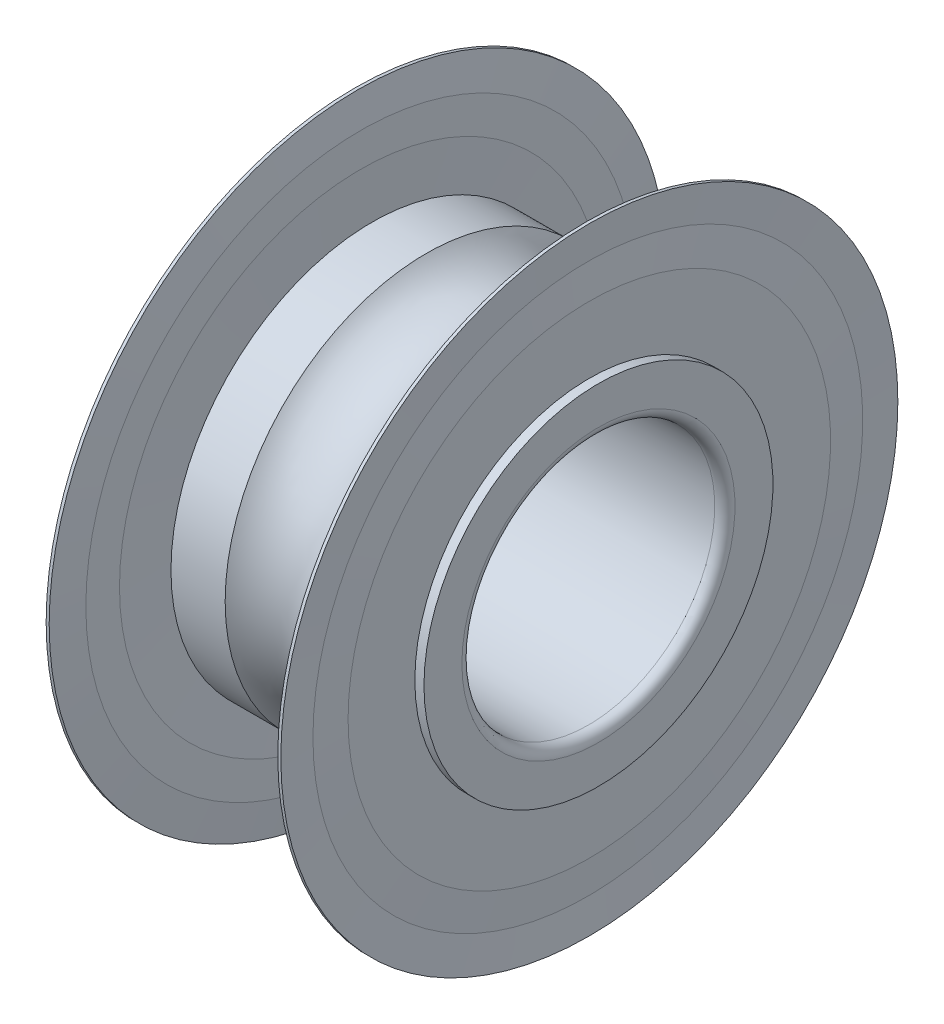
ISO-10303-21;
HEADER;
FILE_DESCRIPTION(('STEP AP214'),'2;1');
FILE_NAME('part.step','',(''),(''),'','','');
FILE_SCHEMA(('AUTOMOTIVE_DESIGN { 1 0 10303 214 1 1 1 1 }'));
ENDSEC;
DATA;
#1=APPLICATION_CONTEXT('core data for automotive mechanical design processes');
#2=APPLICATION_PROTOCOL_DEFINITION('international standard','automotive_design',2000,#1);
#3=PRODUCT_CONTEXT('',#1,'mechanical');
#4=PRODUCT('Part','Part','',(#3));
#5=PRODUCT_RELATED_PRODUCT_CATEGORY('part','',(#4));
#6=PRODUCT_DEFINITION_FORMATION('','',#4);
#7=PRODUCT_DEFINITION_CONTEXT('part definition',#1,'design');
#8=PRODUCT_DEFINITION('design','',#6,#7);
#9=PRODUCT_DEFINITION_SHAPE('','',#8);
#10=(LENGTH_UNIT() NAMED_UNIT(*) SI_UNIT(.MILLI.,.METRE.));
#11=(NAMED_UNIT(*) PLANE_ANGLE_UNIT() SI_UNIT($,.RADIAN.));
#12=(NAMED_UNIT(*) SI_UNIT($,.STERADIAN.) SOLID_ANGLE_UNIT());
#13=UNCERTAINTY_MEASURE_WITH_UNIT(LENGTH_MEASURE(1.E-05),#10,'distance_accuracy_value','');
#14=(GEOMETRIC_REPRESENTATION_CONTEXT(3) GLOBAL_UNCERTAINTY_ASSIGNED_CONTEXT((#13)) GLOBAL_UNIT_ASSIGNED_CONTEXT((#10,
#11,#12)) REPRESENTATION_CONTEXT('',''));
#15=CARTESIAN_POINT('',(0.,0.,0.));
#16=DIRECTION('',(0.,0.,1.));
#17=DIRECTION('',(1.,0.,0.));
#18=AXIS2_PLACEMENT_3D('',#15,#16,#17);
#19=CARTESIAN_POINT('',(50.,0.,0.));
#20=DIRECTION('',(-1.,0.,0.));
#21=DIRECTION('',(0.,0.,1.));
#22=AXIS2_PLACEMENT_3D('',#19,#20,#21);
#23=CYLINDRICAL_SURFACE('',#22,3.45);
#24=CARTESIAN_POINT('',(4.738,0.,0.));
#25=DIRECTION('',(-1.,0.,0.));
#26=DIRECTION('',(0.,0.,1.));
#27=AXIS2_PLACEMENT_3D('',#24,#25,#26);
#28=CIRCLE('',#27,3.45);
#29=CARTESIAN_POINT('',(4.738,0.,3.45));
#30=VERTEX_POINT('',#29);
#31=EDGE_CURVE('E98',#30,#30,#28,.T.);
#32=ORIENTED_EDGE('',*,*,#31,.F.);
#33=EDGE_LOOP('',(#32));
#34=FACE_BOUND('',#33,.T.);
#35=CARTESIAN_POINT('',(4.75954887218045,0.,0.));
#36=DIRECTION('',(-1.,0.,0.));
#37=DIRECTION('',(0.,0.,1.));
#38=AXIS2_PLACEMENT_3D('',#35,#36,#37);
#39=CIRCLE('',#38,3.45);
#40=CARTESIAN_POINT('',(4.75954887218045,0.,3.45));
#41=VERTEX_POINT('',#40);
#42=EDGE_CURVE('E35',#41,#41,#39,.T.);
#43=ORIENTED_EDGE('',*,*,#42,.T.);
#44=EDGE_LOOP('',(#43));
#45=FACE_BOUND('',#44,.T.);
#46=ADVANCED_FACE('F31',(#34,#45),#23,.T.);
#47=CARTESIAN_POINT('',(5.,0.,0.));
#48=DIRECTION('',(-1.,0.,0.));
#49=DIRECTION('',(0.,0.,1.));
#50=AXIS2_PLACEMENT_3D('',#47,#48,#49);
#51=CIRCLE('',#50,3.45);
#52=CARTESIAN_POINT('',(5.,0.,3.45));
#53=VERTEX_POINT('',#52);
#54=EDGE_CURVE('E62',#53,#53,#51,.T.);
#55=ORIENTED_EDGE('',*,*,#54,.T.);
#56=EDGE_LOOP('',(#55));
#57=FACE_BOUND('',#56,.T.);
#58=CARTESIAN_POINT('',(4.82,0.,0.));
#59=DIRECTION('',(-1.,0.,0.));
#60=DIRECTION('',(0.,0.,1.));
#61=AXIS2_PLACEMENT_3D('',#58,#59,#60);
#62=CIRCLE('',#61,3.45);
#63=CARTESIAN_POINT('',(4.82,0.,3.45));
#64=VERTEX_POINT('',#63);
#65=EDGE_CURVE('E63',#64,#64,#62,.F.);
#66=ORIENTED_EDGE('',*,*,#65,.T.);
#67=EDGE_LOOP('',(#66));
#68=FACE_BOUND('',#67,.T.);
#69=ADVANCED_FACE('F140',(#57,#68),#23,.T.);
#70=CARTESIAN_POINT('',(50.,0.,0.));
#71=DIRECTION('',(-1.,0.,0.));
#72=DIRECTION('',(0.,0.,1.));
#73=AXIS2_PLACEMENT_3D('',#70,#71,#72);
#74=CYLINDRICAL_SURFACE('',#73,3.45);
#75=CARTESIAN_POINT('',(0.,0.,0.));
#76=DIRECTION('',(-1.,0.,0.));
#77=DIRECTION('',(0.,0.,1.));
#78=AXIS2_PLACEMENT_3D('',#75,#76,#77);
#79=CIRCLE('',#78,3.45);
#80=CARTESIAN_POINT('',(0.,0.,3.45));
#81=VERTEX_POINT('',#80);
#82=EDGE_CURVE('E52',#81,#81,#79,.T.);
#83=ORIENTED_EDGE('',*,*,#82,.F.);
#84=EDGE_LOOP('',(#83));
#85=FACE_BOUND('',#84,.T.);
#86=CARTESIAN_POINT('',(0.18,0.,0.));
#87=DIRECTION('',(1.,0.,0.));
#88=DIRECTION('',(0.,0.,-1.));
#89=AXIS2_PLACEMENT_3D('',#86,#87,#88);
#90=CIRCLE('',#89,3.45);
#91=CARTESIAN_POINT('',(0.18,0.,-3.45));
#92=VERTEX_POINT('',#91);
#93=EDGE_CURVE('E59',#92,#92,#90,.F.);
#94=ORIENTED_EDGE('',*,*,#93,.T.);
#95=EDGE_LOOP('',(#94));
#96=FACE_BOUND('',#95,.T.);
#97=ADVANCED_FACE('F146',(#85,#96),#74,.T.);
#98=CARTESIAN_POINT('',(0.261999999999998,0.,0.));
#99=DIRECTION('',(-1.,0.,0.));
#100=DIRECTION('',(0.,0.,1.));
#101=AXIS2_PLACEMENT_3D('',#98,#99,#100);
#102=CIRCLE('',#101,3.45);
#103=CARTESIAN_POINT('',(0.261999999999998,0.,3.45));
#104=VERTEX_POINT('',#103);
#105=EDGE_CURVE('E107',#104,#104,#102,.T.);
#106=ORIENTED_EDGE('',*,*,#105,.T.);
#107=EDGE_LOOP('',(#106));
#108=FACE_BOUND('',#107,.T.);
#109=CARTESIAN_POINT('',(0.240451127819546,0.,0.));
#110=DIRECTION('',(1.,0.,0.));
#111=DIRECTION('',(0.,0.,-1.));
#112=AXIS2_PLACEMENT_3D('',#109,#110,#111);
#113=CIRCLE('',#112,3.45);
#114=CARTESIAN_POINT('',(0.240451127819546,0.,-3.45));
#115=VERTEX_POINT('',#114);
#116=EDGE_CURVE('E56',#115,#115,#113,.T.);
#117=ORIENTED_EDGE('',*,*,#116,.T.);
#118=EDGE_LOOP('',(#117));
#119=FACE_BOUND('',#118,.T.);
#120=ADVANCED_FACE('F173',(#108,#119),#74,.T.);
#121=CARTESIAN_POINT('',(5.,2.699825,0.));
#122=DIRECTION('',(-1.,0.,0.));
#123=DIRECTION('',(0.,0.,1.));
#124=AXIS2_PLACEMENT_3D('',#121,#122,#123);
#125=PLANE('',#124);
#126=CARTESIAN_POINT('',(5.,0.,0.));
#127=DIRECTION('',(-1.,0.,0.));
#128=DIRECTION('',(0.,0.,1.));
#129=AXIS2_PLACEMENT_3D('',#126,#127,#128);
#130=CIRCLE('',#129,2.699825);
#131=CARTESIAN_POINT('',(5.,0.,2.699825));
#132=VERTEX_POINT('',#131);
#133=EDGE_CURVE('E44',#132,#132,#130,.T.);
#134=ORIENTED_EDGE('',*,*,#133,.T.);
#135=EDGE_LOOP('',(#134));
#136=FACE_BOUND('',#135,.T.);
#137=ORIENTED_EDGE('',*,*,#54,.F.);
#138=EDGE_LOOP('',(#137));
#139=FACE_BOUND('',#138,.T.);
#140=ADVANCED_FACE('F122',(#136,#139),#125,.F.);
#141=CARTESIAN_POINT('',(0.,3.976,0.));
#142=DIRECTION('',(1.,0.,0.));
#143=DIRECTION('',(0.,0.,-1.));
#144=AXIS2_PLACEMENT_3D('',#141,#142,#143);
#145=PLANE('',#144);
#146=CARTESIAN_POINT('',(0.,0.,0.));
#147=DIRECTION('',(-1.,0.,0.));
#148=DIRECTION('',(0.,0.,1.));
#149=AXIS2_PLACEMENT_3D('',#146,#147,#148);
#150=CIRCLE('',#149,2.699825);
#151=CARTESIAN_POINT('',(0.,0.,2.699825));
#152=VERTEX_POINT('',#151);
#153=EDGE_CURVE('E55',#152,#152,#150,.T.);
#154=ORIENTED_EDGE('',*,*,#153,.F.);
#155=EDGE_LOOP('',(#154));
#156=FACE_BOUND('',#155,.T.);
#157=ORIENTED_EDGE('',*,*,#82,.T.);
#158=EDGE_LOOP('',(#157));
#159=FACE_BOUND('',#158,.T.);
#160=ADVANCED_FACE('F137',(#156,#159),#145,.F.);
#161=CARTESIAN_POINT('',(0.200000000000018,0.,0.));
#162=DIRECTION('',(-1.,0.,0.));
#163=DIRECTION('',(0.,0.,1.));
#164=AXIS2_PLACEMENT_3D('',#161,#162,#163);
#165=TOROIDAL_SURFACE('',#164,2.69982500000002,0.200000000000018);
#166=CARTESIAN_POINT('',(0.199999999999999,0.,0.));
#167=DIRECTION('',(-1.,0.,0.));
#168=DIRECTION('',(0.,0.,1.));
#169=AXIS2_PLACEMENT_3D('',#166,#167,#168);
#170=CIRCLE('',#169,2.499825);
#171=CARTESIAN_POINT('',(0.199999999999999,0.,2.499825));
#172=VERTEX_POINT('',#171);
#173=EDGE_CURVE('E10',#172,#172,#170,.T.);
#174=ORIENTED_EDGE('',*,*,#173,.F.);
#175=EDGE_LOOP('',(#174));
#176=FACE_BOUND('',#175,.T.);
#177=ORIENTED_EDGE('',*,*,#153,.T.);
#178=EDGE_LOOP('',(#177));
#179=FACE_BOUND('',#178,.T.);
#180=ADVANCED_FACE('F33',(#176,#179),#165,.T.);
#181=CARTESIAN_POINT('',(50.,0.,0.));
#182=DIRECTION('',(-1.,0.,0.));
#183=DIRECTION('',(0.,0.,1.));
#184=AXIS2_PLACEMENT_3D('',#181,#182,#183);
#185=CYLINDRICAL_SURFACE('',#184,2.499825);
#186=CARTESIAN_POINT('',(4.8,0.,0.));
#187=DIRECTION('',(-1.,0.,0.));
#188=DIRECTION('',(0.,0.,1.));
#189=AXIS2_PLACEMENT_3D('',#186,#187,#188);
#190=CIRCLE('',#189,2.499825);
#191=CARTESIAN_POINT('',(4.8,0.,2.499825));
#192=VERTEX_POINT('',#191);
#193=EDGE_CURVE('E39',#192,#192,#190,.T.);
#194=ORIENTED_EDGE('',*,*,#193,.F.);
#195=EDGE_LOOP('',(#194));
#196=FACE_BOUND('',#195,.T.);
#197=ORIENTED_EDGE('',*,*,#173,.T.);
#198=EDGE_LOOP('',(#197));
#199=FACE_BOUND('',#198,.T.);
#200=ADVANCED_FACE('F129',(#196,#199),#185,.F.);
#201=CARTESIAN_POINT('',(4.79999999999997,0.,0.));
#202=DIRECTION('',(-1.,0.,0.));
#203=DIRECTION('',(0.,0.,1.));
#204=AXIS2_PLACEMENT_3D('',#201,#202,#203);
#205=TOROIDAL_SURFACE('',#204,2.69982500000003,0.200000000000033);
#206=ORIENTED_EDGE('',*,*,#133,.F.);
#207=EDGE_LOOP('',(#206));
#208=FACE_BOUND('',#207,.T.);
#209=ORIENTED_EDGE('',*,*,#193,.T.);
#210=EDGE_LOOP('',(#209));
#211=FACE_BOUND('',#210,.T.);
#212=ADVANCED_FACE('F125',(#208,#211),#205,.T.);
#213=CARTESIAN_POINT('',(0.524,3.712,0.));
#214=DIRECTION('',(-1.,0.,0.));
#215=DIRECTION('',(0.,0.,1.));
#216=AXIS2_PLACEMENT_3D('',#213,#214,#215);
#217=PLANE('',#216);
#218=CARTESIAN_POINT('',(0.523999999999997,0.,0.));
#219=DIRECTION('',(-1.,0.,0.));
#220=DIRECTION('',(0.,0.,1.));
#221=AXIS2_PLACEMENT_3D('',#218,#219,#220);
#222=CIRCLE('',#221,3.71199999999995);
#223=CARTESIAN_POINT('',(0.523999999999997,0.,3.71199999999995));
#224=VERTEX_POINT('',#223);
#225=EDGE_CURVE('E104',#224,#224,#222,.T.);
#226=ORIENTED_EDGE('',*,*,#225,.F.);
#227=EDGE_LOOP('',(#226));
#228=FACE_BOUND('',#227,.T.);
#229=CARTESIAN_POINT('',(0.523999999999997,0.,0.));
#230=DIRECTION('',(-1.,0.,0.));
#231=DIRECTION('',(0.,0.,1.));
#232=AXIS2_PLACEMENT_3D('',#229,#230,#231);
#233=CIRCLE('',#232,3.976);
#234=CARTESIAN_POINT('',(0.523999999999997,0.,3.976));
#235=VERTEX_POINT('',#234);
#236=EDGE_CURVE('E48',#235,#235,#233,.T.);
#237=ORIENTED_EDGE('',*,*,#236,.T.);
#238=EDGE_LOOP('',(#237));
#239=FACE_BOUND('',#238,.T.);
#240=ADVANCED_FACE('F128',(#228,#239),#217,.T.);
#241=CARTESIAN_POINT('',(0.262000000000049,0.,0.));
#242=DIRECTION('',(-1.,0.,0.));
#243=DIRECTION('',(0.,0.,1.));
#244=AXIS2_PLACEMENT_3D('',#241,#242,#243);
#245=TOROIDAL_SURFACE('',#244,3.71199999999995,0.261999999999951);
#246=ORIENTED_EDGE('',*,*,#225,.T.);
#247=EDGE_LOOP('',(#246));
#248=FACE_BOUND('',#247,.T.);
#249=ORIENTED_EDGE('',*,*,#105,.F.);
#250=EDGE_LOOP('',(#249));
#251=FACE_BOUND('',#250,.T.);
#252=ADVANCED_FACE('F165',(#248,#251),#245,.F.);
#253=CARTESIAN_POINT('',(50.,0.,0.));
#254=DIRECTION('',(-1.,0.,0.));
#255=DIRECTION('',(0.,0.,1.));
#256=AXIS2_PLACEMENT_3D('',#253,#254,#255);
#257=CYLINDRICAL_SURFACE('',#256,3.976);
#258=CARTESIAN_POINT('',(3.4045519609177,0.,0.));
#259=DIRECTION('',(-1.,0.,0.));
#260=DIRECTION('',(0.,0.,1.));
#261=AXIS2_PLACEMENT_3D('',#258,#259,#260);
#262=CIRCLE('',#261,3.976);
#263=CARTESIAN_POINT('',(3.4045519609177,0.,3.976));
#264=VERTEX_POINT('',#263);
#265=EDGE_CURVE('E117',#264,#264,#262,.T.);
#266=ORIENTED_EDGE('',*,*,#265,.F.);
#267=EDGE_LOOP('',(#266));
#268=FACE_BOUND('',#267,.T.);
#269=CARTESIAN_POINT('',(4.476,0.,0.));
#270=DIRECTION('',(1.,0.,0.));
#271=DIRECTION('',(0.,0.,-1.));
#272=AXIS2_PLACEMENT_3D('',#269,#270,#271);
#273=CIRCLE('',#272,3.976);
#274=CARTESIAN_POINT('',(4.476,0.,-3.976));
#275=VERTEX_POINT('',#274);
#276=EDGE_CURVE('E51',#275,#275,#273,.T.);
#277=ORIENTED_EDGE('',*,*,#276,.F.);
#278=EDGE_LOOP('',(#277));
#279=FACE_BOUND('',#278,.T.);
#280=ADVANCED_FACE('F169',(#268,#279),#257,.T.);
#281=CARTESIAN_POINT('',(2.5,0.,0.));
#282=DIRECTION('',(-1.,0.,0.));
#283=DIRECTION('',(0.,0.,1.));
#284=AXIS2_PLACEMENT_3D('',#281,#282,#283);
#285=TOROIDAL_SURFACE('',#284,4.75000000000007,1.19050000000007);
#286=CARTESIAN_POINT('',(1.5954480390823,0.,0.));
#287=DIRECTION('',(-1.,0.,0.));
#288=DIRECTION('',(0.,0.,1.));
#289=AXIS2_PLACEMENT_3D('',#286,#287,#288);
#290=CIRCLE('',#289,3.976);
#291=CARTESIAN_POINT('',(1.5954480390823,0.,3.976));
#292=VERTEX_POINT('',#291);
#293=EDGE_CURVE('E114',#292,#292,#290,.T.);
#294=ORIENTED_EDGE('',*,*,#293,.F.);
#295=EDGE_LOOP('',(#294));
#296=FACE_BOUND('',#295,.T.);
#297=ORIENTED_EDGE('',*,*,#265,.T.);
#298=EDGE_LOOP('',(#297));
#299=FACE_BOUND('',#298,.T.);
#300=ADVANCED_FACE('F180',(#296,#299),#285,.F.);
#301=CARTESIAN_POINT('',(50.,0.,0.));
#302=DIRECTION('',(-1.,0.,0.));
#303=DIRECTION('',(0.,0.,1.));
#304=AXIS2_PLACEMENT_3D('',#301,#302,#303);
#305=CYLINDRICAL_SURFACE('',#304,3.976);
#306=ORIENTED_EDGE('',*,*,#293,.T.);
#307=EDGE_LOOP('',(#306));
#308=FACE_BOUND('',#307,.T.);
#309=ORIENTED_EDGE('',*,*,#236,.F.);
#310=EDGE_LOOP('',(#309));
#311=FACE_BOUND('',#310,.T.);
#312=ADVANCED_FACE('F161',(#308,#311),#305,.T.);
#313=CARTESIAN_POINT('',(4.476,4.1135,0.));
#314=DIRECTION('',(1.,0.,0.));
#315=DIRECTION('',(0.,0.,-1.));
#316=AXIS2_PLACEMENT_3D('',#313,#314,#315);
#317=PLANE('',#316);
#318=CARTESIAN_POINT('',(4.476,0.,0.));
#319=DIRECTION('',(-1.,0.,0.));
#320=DIRECTION('',(0.,0.,1.));
#321=AXIS2_PLACEMENT_3D('',#318,#319,#320);
#322=CIRCLE('',#321,3.712);
#323=CARTESIAN_POINT('',(4.476,0.,3.712));
#324=VERTEX_POINT('',#323);
#325=EDGE_CURVE('E101',#324,#324,#322,.T.);
#326=ORIENTED_EDGE('',*,*,#325,.T.);
#327=EDGE_LOOP('',(#326));
#328=FACE_BOUND('',#327,.T.);
#329=ORIENTED_EDGE('',*,*,#276,.T.);
#330=EDGE_LOOP('',(#329));
#331=FACE_BOUND('',#330,.T.);
#332=ADVANCED_FACE('F157',(#328,#331),#317,.T.);
#333=CARTESIAN_POINT('',(4.73799999999992,0.,0.));
#334=DIRECTION('',(-1.,0.,0.));
#335=DIRECTION('',(0.,0.,1.));
#336=AXIS2_PLACEMENT_3D('',#333,#334,#335);
#337=TOROIDAL_SURFACE('',#336,3.71199999999992,0.261999999999916);
#338=ORIENTED_EDGE('',*,*,#31,.T.);
#339=EDGE_LOOP('',(#338));
#340=FACE_BOUND('',#339,.T.);
#341=ORIENTED_EDGE('',*,*,#325,.F.);
#342=EDGE_LOOP('',(#341));
#343=FACE_BOUND('',#342,.T.);
#344=ADVANCED_FACE('F154',(#340,#343),#337,.F.);
#345=CARTESIAN_POINT('',(50.,0.,0.));
#346=DIRECTION('',(-1.,0.,0.));
#347=DIRECTION('',(0.,0.,1.));
#348=AXIS2_PLACEMENT_3D('',#345,#346,#347);
#349=CYLINDRICAL_SURFACE('',#348,6.1);
#350=CARTESIAN_POINT('',(0.18,0.,0.));
#351=DIRECTION('',(-1.,0.,0.));
#352=DIRECTION('',(0.,0.,1.));
#353=AXIS2_PLACEMENT_3D('',#350,#351,#352);
#354=CIRCLE('',#353,6.1);
#355=CARTESIAN_POINT('',(0.18,0.,6.1));
#356=VERTEX_POINT('',#355);
#357=EDGE_CURVE('E60',#356,#356,#354,.T.);
#358=ORIENTED_EDGE('',*,*,#357,.F.);
#359=EDGE_LOOP('',(#358));
#360=FACE_BOUND('',#359,.T.);
#361=CARTESIAN_POINT('',(0.239999999999997,0.,0.));
#362=DIRECTION('',(-1.,0.,0.));
#363=DIRECTION('',(0.,0.,1.));
#364=AXIS2_PLACEMENT_3D('',#361,#362,#363);
#365=CIRCLE('',#364,6.1);
#366=CARTESIAN_POINT('',(0.239999999999997,0.,6.1));
#367=VERTEX_POINT('',#366);
#368=EDGE_CURVE('E69',#367,#367,#365,.T.);
#369=ORIENTED_EDGE('',*,*,#368,.T.);
#370=EDGE_LOOP('',(#369));
#371=FACE_BOUND('',#370,.T.);
#372=ADVANCED_FACE('F152',(#360,#371),#349,.T.);
#373=CARTESIAN_POINT('',(0.18,0.,0.));
#374=DIRECTION('',(-1.,0.,0.));
#375=DIRECTION('',(0.,0.,1.));
#376=AXIS2_PLACEMENT_3D('',#373,#374,#375);
#377=CONICAL_SURFACE('',#376,6.1,1.52571411148015);
#378=CARTESIAN_POINT('',(0.210000000000002,0.,0.));
#379=DIRECTION('',(-1.,0.,0.));
#380=DIRECTION('',(0.,0.,1.));
#381=AXIS2_PLACEMENT_3D('',#378,#379,#380);
#382=CIRCLE('',#381,5.435);
#383=CARTESIAN_POINT('',(0.210000000000002,0.,5.435));
#384=VERTEX_POINT('',#383);
#385=EDGE_CURVE('E91',#384,#384,#382,.T.);
#386=ORIENTED_EDGE('',*,*,#385,.F.);
#387=EDGE_LOOP('',(#386));
#388=FACE_BOUND('',#387,.T.);
#389=ORIENTED_EDGE('',*,*,#357,.T.);
#390=EDGE_LOOP('',(#389));
#391=FACE_BOUND('',#390,.T.);
#392=ADVANCED_FACE('F225',(#388,#391),#377,.F.);
#393=CARTESIAN_POINT('',(0.210000000000002,0.,0.));
#394=DIRECTION('',(1.,0.,0.));
#395=DIRECTION('',(0.,0.,-1.));
#396=AXIS2_PLACEMENT_3D('',#393,#394,#395);
#397=CONICAL_SURFACE('',#396,5.435,1.52571411148015);
#398=CARTESIAN_POINT('',(0.18,0.,0.));
#399=DIRECTION('',(-1.,0.,0.));
#400=DIRECTION('',(0.,0.,1.));
#401=AXIS2_PLACEMENT_3D('',#398,#399,#400);
#402=CIRCLE('',#401,4.77);
#403=CARTESIAN_POINT('',(0.18,0.,4.77));
#404=VERTEX_POINT('',#403);
#405=EDGE_CURVE('E88',#404,#404,#402,.T.);
#406=ORIENTED_EDGE('',*,*,#405,.F.);
#407=EDGE_LOOP('',(#406));
#408=FACE_BOUND('',#407,.T.);
#409=ORIENTED_EDGE('',*,*,#385,.T.);
#410=EDGE_LOOP('',(#409));
#411=FACE_BOUND('',#410,.T.);
#412=ADVANCED_FACE('F222',(#408,#411),#397,.T.);
#413=CARTESIAN_POINT('',(0.18,4.77,0.));
#414=DIRECTION('',(1.,0.,0.));
#415=DIRECTION('',(0.,0.,-1.));
#416=AXIS2_PLACEMENT_3D('',#413,#414,#415);
#417=PLANE('',#416);
#418=ORIENTED_EDGE('',*,*,#93,.F.);
#419=EDGE_LOOP('',(#418));
#420=FACE_BOUND('',#419,.T.);
#421=ORIENTED_EDGE('',*,*,#405,.T.);
#422=EDGE_LOOP('',(#421));
#423=FACE_BOUND('',#422,.T.);
#424=ADVANCED_FACE('F203',(#420,#423),#417,.F.);
#425=CARTESIAN_POINT('',(0.239999999999997,0.,0.));
#426=DIRECTION('',(1.,0.,0.));
#427=DIRECTION('',(0.,0.,-1.));
#428=AXIS2_PLACEMENT_3D('',#425,#426,#427);
#429=CONICAL_SURFACE('',#428,3.44,1.52571411148015);
#430=ORIENTED_EDGE('',*,*,#116,.F.);
#431=EDGE_LOOP('',(#430));
#432=FACE_BOUND('',#431,.T.);
#433=CARTESIAN_POINT('',(0.300000000000002,0.,0.));
#434=DIRECTION('',(-1.,0.,0.));
#435=DIRECTION('',(0.,0.,1.));
#436=AXIS2_PLACEMENT_3D('',#433,#434,#435);
#437=CIRCLE('',#436,4.77);
#438=CARTESIAN_POINT('',(0.300000000000002,0.,4.77));
#439=VERTEX_POINT('',#438);
#440=EDGE_CURVE('E85',#439,#439,#437,.T.);
#441=ORIENTED_EDGE('',*,*,#440,.F.);
#442=EDGE_LOOP('',(#441));
#443=FACE_BOUND('',#442,.T.);
#444=ADVANCED_FACE('F199',(#432,#443),#429,.F.);
#445=CARTESIAN_POINT('',(0.3,4.77,0.));
#446=DIRECTION('',(-1.,0.,0.));
#447=DIRECTION('',(0.,0.,1.));
#448=AXIS2_PLACEMENT_3D('',#445,#446,#447);
#449=PLANE('',#448);
#450=CARTESIAN_POINT('',(0.300000000000002,0.,0.));
#451=DIRECTION('',(-1.,0.,0.));
#452=DIRECTION('',(0.,0.,1.));
#453=AXIS2_PLACEMENT_3D('',#450,#451,#452);
#454=CIRCLE('',#453,5.435);
#455=CARTESIAN_POINT('',(0.300000000000002,0.,5.435));
#456=VERTEX_POINT('',#455);
#457=EDGE_CURVE('E82',#456,#456,#454,.T.);
#458=ORIENTED_EDGE('',*,*,#457,.F.);
#459=EDGE_LOOP('',(#458));
#460=FACE_BOUND('',#459,.T.);
#461=ORIENTED_EDGE('',*,*,#440,.T.);
#462=EDGE_LOOP('',(#461));
#463=FACE_BOUND('',#462,.T.);
#464=ADVANCED_FACE('F202',(#460,#463),#449,.F.);
#465=CARTESIAN_POINT('',(0.300000000000002,0.,0.));
#466=DIRECTION('',(-1.,0.,0.));
#467=DIRECTION('',(0.,0.,1.));
#468=AXIS2_PLACEMENT_3D('',#465,#466,#467);
#469=CONICAL_SURFACE('',#468,5.435,1.48081440559197);
#470=ORIENTED_EDGE('',*,*,#368,.F.);
#471=EDGE_LOOP('',(#470));
#472=FACE_BOUND('',#471,.T.);
#473=ORIENTED_EDGE('',*,*,#457,.T.);
#474=EDGE_LOOP('',(#473));
#475=FACE_BOUND('',#474,.T.);
#476=ADVANCED_FACE('F208',(#472,#475),#469,.T.);
#477=CARTESIAN_POINT('',(4.76,0.,0.));
#478=DIRECTION('',(1.,0.,0.));
#479=DIRECTION('',(0.,0.,-1.));
#480=AXIS2_PLACEMENT_3D('',#477,#478,#479);
#481=CONICAL_SURFACE('',#480,6.1,1.48081440559198);
#482=CARTESIAN_POINT('',(4.7,0.,0.));
#483=DIRECTION('',(-1.,0.,0.));
#484=DIRECTION('',(0.,0.,1.));
#485=AXIS2_PLACEMENT_3D('',#482,#483,#484);
#486=CIRCLE('',#485,5.435);
#487=CARTESIAN_POINT('',(4.7,0.,5.435));
#488=VERTEX_POINT('',#487);
#489=EDGE_CURVE('E65',#488,#488,#486,.T.);
#490=ORIENTED_EDGE('',*,*,#489,.F.);
#491=EDGE_LOOP('',(#490));
#492=FACE_BOUND('',#491,.T.);
#493=CARTESIAN_POINT('',(4.76,0.,0.));
#494=DIRECTION('',(-1.,0.,0.));
#495=DIRECTION('',(0.,0.,1.));
#496=AXIS2_PLACEMENT_3D('',#493,#494,#495);
#497=CIRCLE('',#496,6.1);
#498=CARTESIAN_POINT('',(4.76,0.,6.1));
#499=VERTEX_POINT('',#498);
#500=EDGE_CURVE('E428',#499,#499,#497,.T.);
#501=ORIENTED_EDGE('',*,*,#500,.T.);
#502=EDGE_LOOP('',(#501));
#503=FACE_BOUND('',#502,.T.);
#504=ADVANCED_FACE('F214',(#492,#503),#481,.T.);
#505=CARTESIAN_POINT('',(4.7,5.435,0.));
#506=DIRECTION('',(1.,0.,0.));
#507=DIRECTION('',(0.,0.,-1.));
#508=AXIS2_PLACEMENT_3D('',#505,#506,#507);
#509=PLANE('',#508);
#510=CARTESIAN_POINT('',(4.7,0.,0.));
#511=DIRECTION('',(-1.,0.,0.));
#512=DIRECTION('',(0.,0.,1.));
#513=AXIS2_PLACEMENT_3D('',#510,#511,#512);
#514=CIRCLE('',#513,4.77);
#515=CARTESIAN_POINT('',(4.7,0.,4.77));
#516=VERTEX_POINT('',#515);
#517=EDGE_CURVE('E71',#516,#516,#514,.T.);
#518=ORIENTED_EDGE('',*,*,#517,.F.);
#519=EDGE_LOOP('',(#518));
#520=FACE_BOUND('',#519,.T.);
#521=ORIENTED_EDGE('',*,*,#489,.T.);
#522=EDGE_LOOP('',(#521));
#523=FACE_BOUND('',#522,.T.);
#524=ADVANCED_FACE('F362',(#520,#523),#509,.F.);
#525=CARTESIAN_POINT('',(4.7,0.,0.));
#526=DIRECTION('',(-1.,0.,0.));
#527=DIRECTION('',(0.,0.,1.));
#528=AXIS2_PLACEMENT_3D('',#525,#526,#527);
#529=CONICAL_SURFACE('',#528,4.77,1.52571411148015);
#530=ORIENTED_EDGE('',*,*,#42,.F.);
#531=EDGE_LOOP('',(#530));
#532=FACE_BOUND('',#531,.T.);
#533=ORIENTED_EDGE('',*,*,#517,.T.);
#534=EDGE_LOOP('',(#533));
#535=FACE_BOUND('',#534,.T.);
#536=ADVANCED_FACE('F370',(#532,#535),#529,.F.);
#537=CARTESIAN_POINT('',(4.82,3.44,0.));
#538=DIRECTION('',(-1.,0.,0.));
#539=DIRECTION('',(0.,0.,1.));
#540=AXIS2_PLACEMENT_3D('',#537,#538,#539);
#541=PLANE('',#540);
#542=ORIENTED_EDGE('',*,*,#65,.F.);
#543=EDGE_LOOP('',(#542));
#544=FACE_BOUND('',#543,.T.);
#545=CARTESIAN_POINT('',(4.82,0.,0.));
#546=DIRECTION('',(-1.,0.,0.));
#547=DIRECTION('',(0.,0.,1.));
#548=AXIS2_PLACEMENT_3D('',#545,#546,#547);
#549=CIRCLE('',#548,4.77);
#550=CARTESIAN_POINT('',(4.82,0.,4.77));
#551=VERTEX_POINT('',#550);
#552=EDGE_CURVE('E76',#551,#551,#549,.T.);
#553=ORIENTED_EDGE('',*,*,#552,.F.);
#554=EDGE_LOOP('',(#553));
#555=FACE_BOUND('',#554,.T.);
#556=ADVANCED_FACE('F379',(#544,#555),#541,.F.);
#557=CARTESIAN_POINT('',(4.82,0.,0.));
#558=DIRECTION('',(-1.,0.,0.));
#559=DIRECTION('',(0.,0.,1.));
#560=AXIS2_PLACEMENT_3D('',#557,#558,#559);
#561=CONICAL_SURFACE('',#560,4.77,1.52571411148016);
#562=CARTESIAN_POINT('',(4.79,0.,0.));
#563=DIRECTION('',(-1.,0.,0.));
#564=DIRECTION('',(0.,0.,1.));
#565=AXIS2_PLACEMENT_3D('',#562,#563,#564);
#566=CIRCLE('',#565,5.435);
#567=CARTESIAN_POINT('',(4.79,0.,5.435));
#568=VERTEX_POINT('',#567);
#569=EDGE_CURVE('E432',#568,#568,#566,.T.);
#570=ORIENTED_EDGE('',*,*,#569,.F.);
#571=EDGE_LOOP('',(#570));
#572=FACE_BOUND('',#571,.T.);
#573=ORIENTED_EDGE('',*,*,#552,.T.);
#574=EDGE_LOOP('',(#573));
#575=FACE_BOUND('',#574,.T.);
#576=ADVANCED_FACE('F388',(#572,#575),#561,.T.);
#577=CARTESIAN_POINT('',(4.79,0.,0.));
#578=DIRECTION('',(1.,0.,0.));
#579=DIRECTION('',(0.,0.,-1.));
#580=AXIS2_PLACEMENT_3D('',#577,#578,#579);
#581=CONICAL_SURFACE('',#580,5.435,1.52571411148016);
#582=CARTESIAN_POINT('',(4.82,0.,0.));
#583=DIRECTION('',(-1.,0.,0.));
#584=DIRECTION('',(0.,0.,1.));
#585=AXIS2_PLACEMENT_3D('',#582,#583,#584);
#586=CIRCLE('',#585,6.1);
#587=CARTESIAN_POINT('',(4.82,0.,6.1));
#588=VERTEX_POINT('',#587);
#589=EDGE_CURVE('E431',#588,#588,#586,.T.);
#590=ORIENTED_EDGE('',*,*,#589,.F.);
#591=EDGE_LOOP('',(#590));
#592=FACE_BOUND('',#591,.T.);
#593=ORIENTED_EDGE('',*,*,#569,.T.);
#594=EDGE_LOOP('',(#593));
#595=FACE_BOUND('',#594,.T.);
#596=ADVANCED_FACE('F397',(#592,#595),#581,.F.);
#597=CARTESIAN_POINT('',(50.,0.,0.));
#598=DIRECTION('',(-1.,0.,0.));
#599=DIRECTION('',(0.,0.,1.));
#600=AXIS2_PLACEMENT_3D('',#597,#598,#599);
#601=CYLINDRICAL_SURFACE('',#600,6.1);
#602=ORIENTED_EDGE('',*,*,#500,.F.);
#603=EDGE_LOOP('',(#602));
#604=FACE_BOUND('',#603,.T.);
#605=ORIENTED_EDGE('',*,*,#589,.T.);
#606=EDGE_LOOP('',(#605));
#607=FACE_BOUND('',#606,.T.);
#608=ADVANCED_FACE('F406',(#604,#607),#601,.T.);
#609=CLOSED_SHELL('',(#46,#69,#97,#120,#140,#160,#180,#200,#212,#240,#252,#280,#300,#312,#332,
#344,#372,#392,#412,#424,#444,#464,#476,#504,#524,#536,#556,#576,#596,#608));
#610=MANIFOLD_SOLID_BREP('B2',#609);
#611=ADVANCED_BREP_SHAPE_REPRESENTATION('',(#18,#610),#14);
#612=SHAPE_DEFINITION_REPRESENTATION(#9,#611);
ENDSEC;
END-ISO-10303-21;
